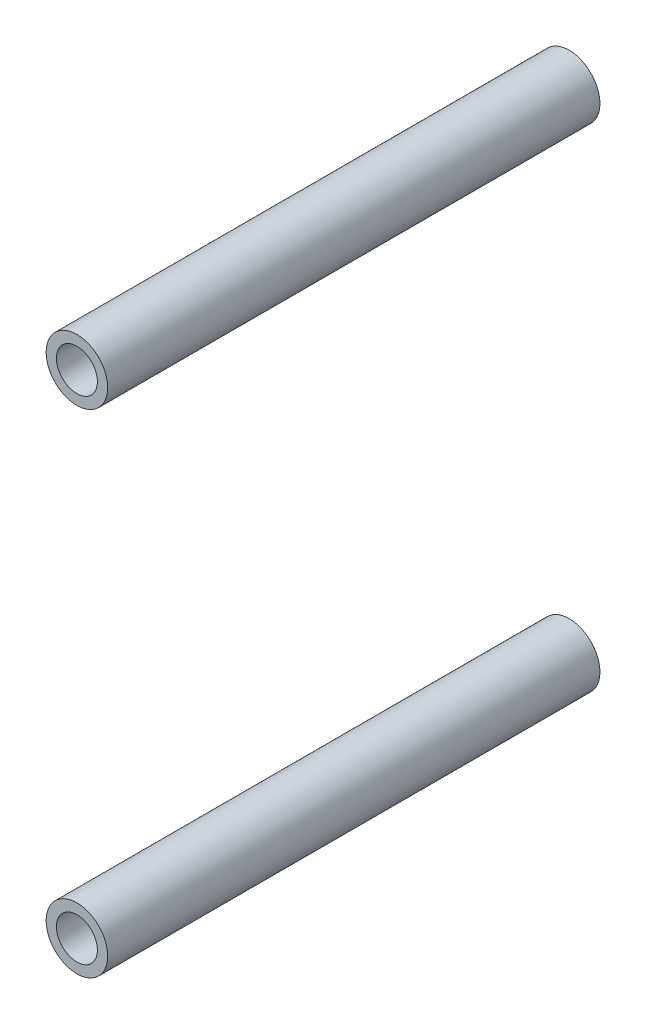
ISO-10303-21;
HEADER;
FILE_DESCRIPTION(('STEP AP214'),'2;1');
FILE_NAME('part.step','',(''),(''),'','','');
FILE_SCHEMA(('AUTOMOTIVE_DESIGN { 1 0 10303 214 1 1 1 1 }'));
ENDSEC;
DATA;
#1=APPLICATION_CONTEXT('core data for automotive mechanical design processes');
#2=APPLICATION_PROTOCOL_DEFINITION('international standard','automotive_design',2000,#1);
#3=PRODUCT_CONTEXT('',#1,'mechanical');
#4=PRODUCT('Part','Part','',(#3));
#5=PRODUCT_RELATED_PRODUCT_CATEGORY('part','',(#4));
#6=PRODUCT_DEFINITION_FORMATION('','',#4);
#7=PRODUCT_DEFINITION_CONTEXT('part definition',#1,'design');
#8=PRODUCT_DEFINITION('design','',#6,#7);
#9=PRODUCT_DEFINITION_SHAPE('','',#8);
#10=(LENGTH_UNIT() NAMED_UNIT(*) SI_UNIT(.MILLI.,.METRE.));
#11=(NAMED_UNIT(*) PLANE_ANGLE_UNIT() SI_UNIT($,.RADIAN.));
#12=(NAMED_UNIT(*) SI_UNIT($,.STERADIAN.) SOLID_ANGLE_UNIT());
#13=UNCERTAINTY_MEASURE_WITH_UNIT(LENGTH_MEASURE(1.E-05),#10,'distance_accuracy_value','');
#14=(GEOMETRIC_REPRESENTATION_CONTEXT(3) GLOBAL_UNCERTAINTY_ASSIGNED_CONTEXT((#13)) GLOBAL_UNIT_ASSIGNED_CONTEXT((#10,
#11,#12)) REPRESENTATION_CONTEXT('',''));
#15=CARTESIAN_POINT('',(0.,0.,0.));
#16=DIRECTION('',(0.,0.,1.));
#17=DIRECTION('',(1.,0.,0.));
#18=AXIS2_PLACEMENT_3D('',#15,#16,#17);
#19=CARTESIAN_POINT('',(514.35,-152.4,152.4));
#20=DIRECTION('',(0.,0.,1.));
#21=DIRECTION('',(1.,0.,0.));
#22=AXIS2_PLACEMENT_3D('',#19,#20,#21);
#23=PLANE('',#22);
#24=CARTESIAN_POINT('',(514.35,-152.4,152.4));
#25=DIRECTION('',(0.,0.,1.));
#26=DIRECTION('',(1.,0.,0.));
#27=AXIS2_PLACEMENT_3D('',#24,#25,#26);
#28=CIRCLE('',#27,19.05);
#29=CARTESIAN_POINT('',(495.3,-152.4,152.4));
#30=VERTEX_POINT('',#29);
#31=EDGE_CURVE('E11',#30,#30,#28,.T.);
#32=ORIENTED_EDGE('',*,*,#31,.T.);
#33=EDGE_LOOP('',(#32));
#34=FACE_BOUND('',#33,.T.);
#35=CARTESIAN_POINT('',(514.35,-152.4,152.4));
#36=DIRECTION('',(0.,0.,1.));
#37=DIRECTION('',(1.,0.,0.));
#38=AXIS2_PLACEMENT_3D('',#35,#36,#37);
#39=CIRCLE('',#38,12.7);
#40=CARTESIAN_POINT('',(501.65,-152.4,152.4));
#41=VERTEX_POINT('',#40);
#42=EDGE_CURVE('E50',#41,#41,#39,.T.);
#43=ORIENTED_EDGE('',*,*,#42,.F.);
#44=EDGE_LOOP('',(#43));
#45=FACE_BOUND('',#44,.T.);
#46=ADVANCED_FACE('F39',(#34,#45),#23,.T.);
#47=CARTESIAN_POINT('',(514.35,-152.4,-152.4));
#48=DIRECTION('',(0.,0.,1.));
#49=DIRECTION('',(1.,0.,0.));
#50=AXIS2_PLACEMENT_3D('',#47,#48,#49);
#51=PLANE('',#50);
#52=CARTESIAN_POINT('',(514.35,-152.4,-152.4));
#53=DIRECTION('',(0.,0.,1.));
#54=DIRECTION('',(1.,0.,0.));
#55=AXIS2_PLACEMENT_3D('',#52,#53,#54);
#56=CIRCLE('',#55,19.05);
#57=CARTESIAN_POINT('',(495.3,-152.4,-152.4));
#58=VERTEX_POINT('',#57);
#59=EDGE_CURVE('E46',#58,#58,#56,.T.);
#60=ORIENTED_EDGE('',*,*,#59,.F.);
#61=EDGE_LOOP('',(#60));
#62=FACE_BOUND('',#61,.T.);
#63=CARTESIAN_POINT('',(514.35,-152.4,-152.4));
#64=DIRECTION('',(0.,0.,1.));
#65=DIRECTION('',(1.,0.,0.));
#66=AXIS2_PLACEMENT_3D('',#63,#64,#65);
#67=CIRCLE('',#66,12.7);
#68=CARTESIAN_POINT('',(501.65,-152.4,-152.4));
#69=VERTEX_POINT('',#68);
#70=EDGE_CURVE('E54',#69,#69,#67,.T.);
#71=ORIENTED_EDGE('',*,*,#70,.T.);
#72=EDGE_LOOP('',(#71));
#73=FACE_BOUND('',#72,.T.);
#74=ADVANCED_FACE('F60',(#62,#73),#51,.F.);
#75=CARTESIAN_POINT('',(514.35,-152.4,152.4));
#76=DIRECTION('',(0.,0.,-1.));
#77=DIRECTION('',(-1.,0.,0.));
#78=AXIS2_PLACEMENT_3D('',#75,#76,#77);
#79=CYLINDRICAL_SURFACE('',#78,19.05);
#80=CARTESIAN_POINT('',(495.3,-152.4,152.4));
#81=CARTESIAN_POINT('',(495.3,-152.4,149.225));
#82=CARTESIAN_POINT('',(495.3,-152.4,146.05));
#83=CARTESIAN_POINT('',(495.3,-152.4,139.7));
#84=CARTESIAN_POINT('',(495.3,-152.4,136.525));
#85=CARTESIAN_POINT('',(495.3,-152.4,130.175));
#86=CARTESIAN_POINT('',(495.3,-152.4,127.));
#87=CARTESIAN_POINT('',(495.3,-152.4,120.65));
#88=CARTESIAN_POINT('',(495.3,-152.4,117.475));
#89=CARTESIAN_POINT('',(495.3,-152.4,111.125));
#90=CARTESIAN_POINT('',(495.3,-152.4,107.95));
#91=CARTESIAN_POINT('',(495.3,-152.4,101.6));
#92=CARTESIAN_POINT('',(495.3,-152.4,98.425));
#93=CARTESIAN_POINT('',(495.3,-152.4,92.075));
#94=CARTESIAN_POINT('',(495.3,-152.4,88.9));
#95=CARTESIAN_POINT('',(495.3,-152.4,82.55));
#96=CARTESIAN_POINT('',(495.3,-152.4,79.375));
#97=CARTESIAN_POINT('',(495.3,-152.4,73.025));
#98=CARTESIAN_POINT('',(495.3,-152.4,69.85));
#99=CARTESIAN_POINT('',(495.3,-152.4,63.5));
#100=CARTESIAN_POINT('',(495.3,-152.4,60.325));
#101=CARTESIAN_POINT('',(495.3,-152.4,53.975));
#102=CARTESIAN_POINT('',(495.3,-152.4,50.8));
#103=CARTESIAN_POINT('',(495.3,-152.4,44.45));
#104=CARTESIAN_POINT('',(495.3,-152.4,41.275));
#105=CARTESIAN_POINT('',(495.3,-152.4,34.925));
#106=CARTESIAN_POINT('',(495.3,-152.4,31.75));
#107=CARTESIAN_POINT('',(495.3,-152.4,25.4));
#108=CARTESIAN_POINT('',(495.3,-152.4,22.225));
#109=CARTESIAN_POINT('',(495.3,-152.4,15.875));
#110=CARTESIAN_POINT('',(495.3,-152.4,12.7));
#111=CARTESIAN_POINT('',(495.3,-152.4,6.35));
#112=CARTESIAN_POINT('',(495.3,-152.4,3.175));
#113=CARTESIAN_POINT('',(495.3,-152.4,-3.175));
#114=CARTESIAN_POINT('',(495.3,-152.4,-6.35));
#115=CARTESIAN_POINT('',(495.3,-152.4,-12.7));
#116=CARTESIAN_POINT('',(495.3,-152.4,-15.875));
#117=CARTESIAN_POINT('',(495.3,-152.4,-22.225));
#118=CARTESIAN_POINT('',(495.3,-152.4,-25.4));
#119=CARTESIAN_POINT('',(495.3,-152.4,-31.75));
#120=CARTESIAN_POINT('',(495.3,-152.4,-34.925));
#121=CARTESIAN_POINT('',(495.3,-152.4,-41.275));
#122=CARTESIAN_POINT('',(495.3,-152.4,-44.45));
#123=CARTESIAN_POINT('',(495.3,-152.4,-50.8));
#124=CARTESIAN_POINT('',(495.3,-152.4,-53.975));
#125=CARTESIAN_POINT('',(495.3,-152.4,-60.325));
#126=CARTESIAN_POINT('',(495.3,-152.4,-63.5));
#127=CARTESIAN_POINT('',(495.3,-152.4,-69.85));
#128=CARTESIAN_POINT('',(495.3,-152.4,-73.025));
#129=CARTESIAN_POINT('',(495.3,-152.4,-79.375));
#130=CARTESIAN_POINT('',(495.3,-152.4,-82.55));
#131=CARTESIAN_POINT('',(495.3,-152.4,-88.9));
#132=CARTESIAN_POINT('',(495.3,-152.4,-92.075));
#133=CARTESIAN_POINT('',(495.3,-152.4,-98.425));
#134=CARTESIAN_POINT('',(495.3,-152.4,-101.6));
#135=CARTESIAN_POINT('',(495.3,-152.4,-107.95));
#136=CARTESIAN_POINT('',(495.3,-152.4,-111.125));
#137=CARTESIAN_POINT('',(495.3,-152.4,-117.475));
#138=CARTESIAN_POINT('',(495.3,-152.4,-120.65));
#139=CARTESIAN_POINT('',(495.3,-152.4,-127.));
#140=CARTESIAN_POINT('',(495.3,-152.4,-130.175));
#141=CARTESIAN_POINT('',(495.3,-152.4,-136.525));
#142=CARTESIAN_POINT('',(495.3,-152.4,-139.7));
#143=CARTESIAN_POINT('',(495.3,-152.4,-146.05));
#144=CARTESIAN_POINT('',(495.3,-152.4,-149.225));
#145=CARTESIAN_POINT('',(495.3,-152.4,-152.4));
#146=B_SPLINE_CURVE_WITH_KNOTS('',3,(#80,#81,#82,#83,#84,#85,#86,#87,#88,#89,#90,#91,#92,#93,
#94,#95,#96,#97,#98,#99,#100,#101,#102,#103,#104,#105,#106,#107,#108,#109,#110,#111,#112,#113,
#114,#115,#116,#117,#118,#119,#120,#121,#122,#123,#124,#125,#126,#127,#128,#129,#130,#131,#132,
#133,#134,#135,#136,#137,#138,#139,#140,#141,#142,#143,#144,#145),.UNSPECIFIED.,.F.,.F.,(4,2,2,
2,2,2,2,2,2,2,2,2,2,2,2,2,2,2,2,2,2,2,2,2,2,2,2,2,2,2,2,2,4),(0.,9.52500000000001,19.05,28.575,
38.1,47.625,57.15,66.675,76.2,85.725,95.25,104.775,114.3,123.825,133.35,142.875,152.4,161.925,
171.45,180.975,190.5,200.025,209.55,219.075,228.6,238.125,247.65,257.175,266.7,276.225,285.75,
295.275,304.8),.UNSPECIFIED.);
#147=EDGE_CURVE('BSEAM41',#30,#58,#146,.T.);
#148=ORIENTED_EDGE('',*,*,#31,.F.);
#149=ORIENTED_EDGE('',*,*,#59,.T.);
#150=ORIENTED_EDGE('',*,*,#147,.T.);
#151=ORIENTED_EDGE('',*,*,#147,.F.);
#152=EDGE_LOOP('',(#148,#150,#149,#151));
#153=FACE_BOUND('',#152,.T.);
#154=ADVANCED_FACE('F41',(#153),#79,.T.);
#155=CARTESIAN_POINT('',(514.35,-152.4,152.4));
#156=DIRECTION('',(0.,0.,-1.));
#157=DIRECTION('',(-1.,0.,0.));
#158=AXIS2_PLACEMENT_3D('',#155,#156,#157);
#159=CYLINDRICAL_SURFACE('',#158,12.7);
#160=CARTESIAN_POINT('',(501.65,-152.4,152.4));
#161=CARTESIAN_POINT('',(501.65,-152.4,149.225));
#162=CARTESIAN_POINT('',(501.65,-152.4,146.05));
#163=CARTESIAN_POINT('',(501.65,-152.4,139.7));
#164=CARTESIAN_POINT('',(501.65,-152.4,136.525));
#165=CARTESIAN_POINT('',(501.65,-152.4,130.175));
#166=CARTESIAN_POINT('',(501.65,-152.4,127.));
#167=CARTESIAN_POINT('',(501.65,-152.4,120.65));
#168=CARTESIAN_POINT('',(501.65,-152.4,117.475));
#169=CARTESIAN_POINT('',(501.65,-152.4,111.125));
#170=CARTESIAN_POINT('',(501.65,-152.4,107.95));
#171=CARTESIAN_POINT('',(501.65,-152.4,101.6));
#172=CARTESIAN_POINT('',(501.65,-152.4,98.425));
#173=CARTESIAN_POINT('',(501.65,-152.4,92.075));
#174=CARTESIAN_POINT('',(501.65,-152.4,88.9));
#175=CARTESIAN_POINT('',(501.65,-152.4,82.55));
#176=CARTESIAN_POINT('',(501.65,-152.4,79.375));
#177=CARTESIAN_POINT('',(501.65,-152.4,73.025));
#178=CARTESIAN_POINT('',(501.65,-152.4,69.85));
#179=CARTESIAN_POINT('',(501.65,-152.4,63.5));
#180=CARTESIAN_POINT('',(501.65,-152.4,60.325));
#181=CARTESIAN_POINT('',(501.65,-152.4,53.975));
#182=CARTESIAN_POINT('',(501.65,-152.4,50.8));
#183=CARTESIAN_POINT('',(501.65,-152.4,44.45));
#184=CARTESIAN_POINT('',(501.65,-152.4,41.275));
#185=CARTESIAN_POINT('',(501.65,-152.4,34.925));
#186=CARTESIAN_POINT('',(501.65,-152.4,31.75));
#187=CARTESIAN_POINT('',(501.65,-152.4,25.4));
#188=CARTESIAN_POINT('',(501.65,-152.4,22.225));
#189=CARTESIAN_POINT('',(501.65,-152.4,15.875));
#190=CARTESIAN_POINT('',(501.65,-152.4,12.7));
#191=CARTESIAN_POINT('',(501.65,-152.4,6.35));
#192=CARTESIAN_POINT('',(501.65,-152.4,3.175));
#193=CARTESIAN_POINT('',(501.65,-152.4,-3.175));
#194=CARTESIAN_POINT('',(501.65,-152.4,-6.35));
#195=CARTESIAN_POINT('',(501.65,-152.4,-12.7));
#196=CARTESIAN_POINT('',(501.65,-152.4,-15.875));
#197=CARTESIAN_POINT('',(501.65,-152.4,-22.225));
#198=CARTESIAN_POINT('',(501.65,-152.4,-25.4));
#199=CARTESIAN_POINT('',(501.65,-152.4,-31.75));
#200=CARTESIAN_POINT('',(501.65,-152.4,-34.925));
#201=CARTESIAN_POINT('',(501.65,-152.4,-41.275));
#202=CARTESIAN_POINT('',(501.65,-152.4,-44.45));
#203=CARTESIAN_POINT('',(501.65,-152.4,-50.8));
#204=CARTESIAN_POINT('',(501.65,-152.4,-53.975));
#205=CARTESIAN_POINT('',(501.65,-152.4,-60.325));
#206=CARTESIAN_POINT('',(501.65,-152.4,-63.5));
#207=CARTESIAN_POINT('',(501.65,-152.4,-69.85));
#208=CARTESIAN_POINT('',(501.65,-152.4,-73.025));
#209=CARTESIAN_POINT('',(501.65,-152.4,-79.375));
#210=CARTESIAN_POINT('',(501.65,-152.4,-82.55));
#211=CARTESIAN_POINT('',(501.65,-152.4,-88.9));
#212=CARTESIAN_POINT('',(501.65,-152.4,-92.075));
#213=CARTESIAN_POINT('',(501.65,-152.4,-98.425));
#214=CARTESIAN_POINT('',(501.65,-152.4,-101.6));
#215=CARTESIAN_POINT('',(501.65,-152.4,-107.95));
#216=CARTESIAN_POINT('',(501.65,-152.4,-111.125));
#217=CARTESIAN_POINT('',(501.65,-152.4,-117.475));
#218=CARTESIAN_POINT('',(501.65,-152.4,-120.65));
#219=CARTESIAN_POINT('',(501.65,-152.4,-127.));
#220=CARTESIAN_POINT('',(501.65,-152.4,-130.175));
#221=CARTESIAN_POINT('',(501.65,-152.4,-136.525));
#222=CARTESIAN_POINT('',(501.65,-152.4,-139.7));
#223=CARTESIAN_POINT('',(501.65,-152.4,-146.05));
#224=CARTESIAN_POINT('',(501.65,-152.4,-149.225));
#225=CARTESIAN_POINT('',(501.65,-152.4,-152.4));
#226=B_SPLINE_CURVE_WITH_KNOTS('',3,(#160,#161,#162,#163,#164,#165,#166,#167,#168,#169,#170,
#171,#172,#173,#174,#175,#176,#177,#178,#179,#180,#181,#182,#183,#184,#185,#186,#187,#188,#189,
#190,#191,#192,#193,#194,#195,#196,#197,#198,#199,#200,#201,#202,#203,#204,#205,#206,#207,#208,
#209,#210,#211,#212,#213,#214,#215,#216,#217,#218,#219,#220,#221,#222,#223,#224,#225),
.UNSPECIFIED.,.F.,.F.,(4,2,2,2,2,2,2,2,2,2,2,2,2,2,2,2,2,2,2,2,2,2,2,2,2,2,2,2,2,2,2,2,4),(0.,
9.52500000000001,19.05,28.575,38.1,47.625,57.15,66.675,76.2,85.725,95.25,104.775,114.3,123.825,
133.35,142.875,152.4,161.925,171.45,180.975,190.5,200.025,209.55,219.075,228.6,238.125,247.65,
257.175,266.7,276.225,285.75,295.275,304.8),.UNSPECIFIED.);
#227=EDGE_CURVE('BSEAM62',#41,#69,#226,.T.);
#228=ORIENTED_EDGE('',*,*,#42,.T.);
#229=ORIENTED_EDGE('',*,*,#70,.F.);
#230=ORIENTED_EDGE('',*,*,#227,.T.);
#231=ORIENTED_EDGE('',*,*,#227,.F.);
#232=EDGE_LOOP('',(#228,#230,#229,#231));
#233=FACE_BOUND('',#232,.T.);
#234=ADVANCED_FACE('F62',(#233),#159,.F.);
#235=CLOSED_SHELL('',(#46,#74,#154,#234));
#236=MANIFOLD_SOLID_BREP('B2',#235);
#237=CARTESIAN_POINT('',(514.35,152.4,152.4));
#238=DIRECTION('',(0.,0.,1.));
#239=DIRECTION('',(1.,0.,0.));
#240=AXIS2_PLACEMENT_3D('',#237,#238,#239);
#241=PLANE('',#240);
#242=CARTESIAN_POINT('',(514.35,152.4,152.4));
#243=DIRECTION('',(0.,0.,1.));
#244=DIRECTION('',(1.,0.,0.));
#245=AXIS2_PLACEMENT_3D('',#242,#243,#244);
#246=CIRCLE('',#245,19.05);
#247=CARTESIAN_POINT('',(495.3,152.4,152.4));
#248=VERTEX_POINT('',#247);
#249=EDGE_CURVE('E38',#248,#248,#246,.T.);
#250=ORIENTED_EDGE('',*,*,#249,.T.);
#251=EDGE_LOOP('',(#250));
#252=FACE_BOUND('',#251,.T.);
#253=CARTESIAN_POINT('',(514.35,152.4,152.4));
#254=DIRECTION('',(0.,0.,1.));
#255=DIRECTION('',(1.,0.,0.));
#256=AXIS2_PLACEMENT_3D('',#253,#254,#255);
#257=CIRCLE('',#256,12.7);
#258=CARTESIAN_POINT('',(501.65,152.4,152.4));
#259=VERTEX_POINT('',#258);
#260=EDGE_CURVE('E107',#259,#259,#257,.T.);
#261=ORIENTED_EDGE('',*,*,#260,.F.);
#262=EDGE_LOOP('',(#261));
#263=FACE_BOUND('',#262,.T.);
#264=ADVANCED_FACE('F96',(#252,#263),#241,.T.);
#265=CARTESIAN_POINT('',(514.35,152.4,-152.4));
#266=DIRECTION('',(0.,0.,1.));
#267=DIRECTION('',(1.,0.,0.));
#268=AXIS2_PLACEMENT_3D('',#265,#266,#267);
#269=PLANE('',#268);
#270=CARTESIAN_POINT('',(514.35,152.4,-152.4));
#271=DIRECTION('',(0.,0.,1.));
#272=DIRECTION('',(1.,0.,0.));
#273=AXIS2_PLACEMENT_3D('',#270,#271,#272);
#274=CIRCLE('',#273,19.05);
#275=CARTESIAN_POINT('',(495.3,152.4,-152.4));
#276=VERTEX_POINT('',#275);
#277=EDGE_CURVE('E103',#276,#276,#274,.T.);
#278=ORIENTED_EDGE('',*,*,#277,.F.);
#279=EDGE_LOOP('',(#278));
#280=FACE_BOUND('',#279,.T.);
#281=CARTESIAN_POINT('',(514.35,152.4,-152.4));
#282=DIRECTION('',(0.,0.,1.));
#283=DIRECTION('',(1.,0.,0.));
#284=AXIS2_PLACEMENT_3D('',#281,#282,#283);
#285=CIRCLE('',#284,12.7);
#286=CARTESIAN_POINT('',(501.65,152.4,-152.4));
#287=VERTEX_POINT('',#286);
#288=EDGE_CURVE('E111',#287,#287,#285,.T.);
#289=ORIENTED_EDGE('',*,*,#288,.T.);
#290=EDGE_LOOP('',(#289));
#291=FACE_BOUND('',#290,.T.);
#292=ADVANCED_FACE('F117',(#280,#291),#269,.F.);
#293=CARTESIAN_POINT('',(514.35,152.4,152.4));
#294=DIRECTION('',(0.,0.,-1.));
#295=DIRECTION('',(-1.,0.,0.));
#296=AXIS2_PLACEMENT_3D('',#293,#294,#295);
#297=CYLINDRICAL_SURFACE('',#296,19.05);
#298=CARTESIAN_POINT('',(495.3,152.4,152.4));
#299=CARTESIAN_POINT('',(495.3,152.4,149.225));
#300=CARTESIAN_POINT('',(495.3,152.4,146.05));
#301=CARTESIAN_POINT('',(495.3,152.4,139.7));
#302=CARTESIAN_POINT('',(495.3,152.4,136.525));
#303=CARTESIAN_POINT('',(495.3,152.4,130.175));
#304=CARTESIAN_POINT('',(495.3,152.4,127.));
#305=CARTESIAN_POINT('',(495.3,152.4,120.65));
#306=CARTESIAN_POINT('',(495.3,152.4,117.475));
#307=CARTESIAN_POINT('',(495.3,152.4,111.125));
#308=CARTESIAN_POINT('',(495.3,152.4,107.95));
#309=CARTESIAN_POINT('',(495.3,152.4,101.6));
#310=CARTESIAN_POINT('',(495.3,152.4,98.425));
#311=CARTESIAN_POINT('',(495.3,152.4,92.075));
#312=CARTESIAN_POINT('',(495.3,152.4,88.9));
#313=CARTESIAN_POINT('',(495.3,152.4,82.55));
#314=CARTESIAN_POINT('',(495.3,152.4,79.375));
#315=CARTESIAN_POINT('',(495.3,152.4,73.025));
#316=CARTESIAN_POINT('',(495.3,152.4,69.85));
#317=CARTESIAN_POINT('',(495.3,152.4,63.5));
#318=CARTESIAN_POINT('',(495.3,152.4,60.325));
#319=CARTESIAN_POINT('',(495.3,152.4,53.975));
#320=CARTESIAN_POINT('',(495.3,152.4,50.8));
#321=CARTESIAN_POINT('',(495.3,152.4,44.45));
#322=CARTESIAN_POINT('',(495.3,152.4,41.275));
#323=CARTESIAN_POINT('',(495.3,152.4,34.925));
#324=CARTESIAN_POINT('',(495.3,152.4,31.75));
#325=CARTESIAN_POINT('',(495.3,152.4,25.4));
#326=CARTESIAN_POINT('',(495.3,152.4,22.225));
#327=CARTESIAN_POINT('',(495.3,152.4,15.875));
#328=CARTESIAN_POINT('',(495.3,152.4,12.7));
#329=CARTESIAN_POINT('',(495.3,152.4,6.35));
#330=CARTESIAN_POINT('',(495.3,152.4,3.175));
#331=CARTESIAN_POINT('',(495.3,152.4,-3.175));
#332=CARTESIAN_POINT('',(495.3,152.4,-6.35));
#333=CARTESIAN_POINT('',(495.3,152.4,-12.7));
#334=CARTESIAN_POINT('',(495.3,152.4,-15.875));
#335=CARTESIAN_POINT('',(495.3,152.4,-22.225));
#336=CARTESIAN_POINT('',(495.3,152.4,-25.4));
#337=CARTESIAN_POINT('',(495.3,152.4,-31.75));
#338=CARTESIAN_POINT('',(495.3,152.4,-34.925));
#339=CARTESIAN_POINT('',(495.3,152.4,-41.275));
#340=CARTESIAN_POINT('',(495.3,152.4,-44.45));
#341=CARTESIAN_POINT('',(495.3,152.4,-50.8));
#342=CARTESIAN_POINT('',(495.3,152.4,-53.975));
#343=CARTESIAN_POINT('',(495.3,152.4,-60.325));
#344=CARTESIAN_POINT('',(495.3,152.4,-63.5));
#345=CARTESIAN_POINT('',(495.3,152.4,-69.85));
#346=CARTESIAN_POINT('',(495.3,152.4,-73.025));
#347=CARTESIAN_POINT('',(495.3,152.4,-79.375));
#348=CARTESIAN_POINT('',(495.3,152.4,-82.55));
#349=CARTESIAN_POINT('',(495.3,152.4,-88.9));
#350=CARTESIAN_POINT('',(495.3,152.4,-92.075));
#351=CARTESIAN_POINT('',(495.3,152.4,-98.425));
#352=CARTESIAN_POINT('',(495.3,152.4,-101.6));
#353=CARTESIAN_POINT('',(495.3,152.4,-107.95));
#354=CARTESIAN_POINT('',(495.3,152.4,-111.125));
#355=CARTESIAN_POINT('',(495.3,152.4,-117.475));
#356=CARTESIAN_POINT('',(495.3,152.4,-120.65));
#357=CARTESIAN_POINT('',(495.3,152.4,-127.));
#358=CARTESIAN_POINT('',(495.3,152.4,-130.175));
#359=CARTESIAN_POINT('',(495.3,152.4,-136.525));
#360=CARTESIAN_POINT('',(495.3,152.4,-139.7));
#361=CARTESIAN_POINT('',(495.3,152.4,-146.05));
#362=CARTESIAN_POINT('',(495.3,152.4,-149.225));
#363=CARTESIAN_POINT('',(495.3,152.4,-152.4));
#364=B_SPLINE_CURVE_WITH_KNOTS('',3,(#298,#299,#300,#301,#302,#303,#304,#305,#306,#307,#308,
#309,#310,#311,#312,#313,#314,#315,#316,#317,#318,#319,#320,#321,#322,#323,#324,#325,#326,#327,
#328,#329,#330,#331,#332,#333,#334,#335,#336,#337,#338,#339,#340,#341,#342,#343,#344,#345,#346,
#347,#348,#349,#350,#351,#352,#353,#354,#355,#356,#357,#358,#359,#360,#361,#362,#363),
.UNSPECIFIED.,.F.,.F.,(4,2,2,2,2,2,2,2,2,2,2,2,2,2,2,2,2,2,2,2,2,2,2,2,2,2,2,2,2,2,2,2,4),(0.,
9.52500000000001,19.05,28.575,38.1,47.625,57.15,66.675,76.2,85.725,95.25,104.775,114.3,123.825,
133.35,142.875,152.4,161.925,171.45,180.975,190.5,200.025,209.55,219.075,228.6,238.125,247.65,
257.175,266.7,276.225,285.75,295.275,304.8),.UNSPECIFIED.);
#365=EDGE_CURVE('BSEAM98',#248,#276,#364,.T.);
#366=ORIENTED_EDGE('',*,*,#249,.F.);
#367=ORIENTED_EDGE('',*,*,#277,.T.);
#368=ORIENTED_EDGE('',*,*,#365,.T.);
#369=ORIENTED_EDGE('',*,*,#365,.F.);
#370=EDGE_LOOP('',(#366,#368,#367,#369));
#371=FACE_BOUND('',#370,.T.);
#372=ADVANCED_FACE('F98',(#371),#297,.T.);
#373=CARTESIAN_POINT('',(514.35,152.4,152.4));
#374=DIRECTION('',(0.,0.,-1.));
#375=DIRECTION('',(-1.,0.,0.));
#376=AXIS2_PLACEMENT_3D('',#373,#374,#375);
#377=CYLINDRICAL_SURFACE('',#376,12.7);
#378=CARTESIAN_POINT('',(501.65,152.4,152.4));
#379=CARTESIAN_POINT('',(501.65,152.4,149.225));
#380=CARTESIAN_POINT('',(501.65,152.4,146.05));
#381=CARTESIAN_POINT('',(501.65,152.4,139.7));
#382=CARTESIAN_POINT('',(501.65,152.4,136.525));
#383=CARTESIAN_POINT('',(501.65,152.4,130.175));
#384=CARTESIAN_POINT('',(501.65,152.4,127.));
#385=CARTESIAN_POINT('',(501.65,152.4,120.65));
#386=CARTESIAN_POINT('',(501.65,152.4,117.475));
#387=CARTESIAN_POINT('',(501.65,152.4,111.125));
#388=CARTESIAN_POINT('',(501.65,152.4,107.95));
#389=CARTESIAN_POINT('',(501.65,152.4,101.6));
#390=CARTESIAN_POINT('',(501.65,152.4,98.425));
#391=CARTESIAN_POINT('',(501.65,152.4,92.075));
#392=CARTESIAN_POINT('',(501.65,152.4,88.9));
#393=CARTESIAN_POINT('',(501.65,152.4,82.55));
#394=CARTESIAN_POINT('',(501.65,152.4,79.375));
#395=CARTESIAN_POINT('',(501.65,152.4,73.025));
#396=CARTESIAN_POINT('',(501.65,152.4,69.85));
#397=CARTESIAN_POINT('',(501.65,152.4,63.5));
#398=CARTESIAN_POINT('',(501.65,152.4,60.325));
#399=CARTESIAN_POINT('',(501.65,152.4,53.975));
#400=CARTESIAN_POINT('',(501.65,152.4,50.8));
#401=CARTESIAN_POINT('',(501.65,152.4,44.45));
#402=CARTESIAN_POINT('',(501.65,152.4,41.275));
#403=CARTESIAN_POINT('',(501.65,152.4,34.925));
#404=CARTESIAN_POINT('',(501.65,152.4,31.75));
#405=CARTESIAN_POINT('',(501.65,152.4,25.4));
#406=CARTESIAN_POINT('',(501.65,152.4,22.225));
#407=CARTESIAN_POINT('',(501.65,152.4,15.875));
#408=CARTESIAN_POINT('',(501.65,152.4,12.7));
#409=CARTESIAN_POINT('',(501.65,152.4,6.35));
#410=CARTESIAN_POINT('',(501.65,152.4,3.175));
#411=CARTESIAN_POINT('',(501.65,152.4,-3.175));
#412=CARTESIAN_POINT('',(501.65,152.4,-6.35));
#413=CARTESIAN_POINT('',(501.65,152.4,-12.7));
#414=CARTESIAN_POINT('',(501.65,152.4,-15.875));
#415=CARTESIAN_POINT('',(501.65,152.4,-22.225));
#416=CARTESIAN_POINT('',(501.65,152.4,-25.4));
#417=CARTESIAN_POINT('',(501.65,152.4,-31.75));
#418=CARTESIAN_POINT('',(501.65,152.4,-34.925));
#419=CARTESIAN_POINT('',(501.65,152.4,-41.275));
#420=CARTESIAN_POINT('',(501.65,152.4,-44.45));
#421=CARTESIAN_POINT('',(501.65,152.4,-50.8));
#422=CARTESIAN_POINT('',(501.65,152.4,-53.975));
#423=CARTESIAN_POINT('',(501.65,152.4,-60.325));
#424=CARTESIAN_POINT('',(501.65,152.4,-63.5));
#425=CARTESIAN_POINT('',(501.65,152.4,-69.85));
#426=CARTESIAN_POINT('',(501.65,152.4,-73.025));
#427=CARTESIAN_POINT('',(501.65,152.4,-79.375));
#428=CARTESIAN_POINT('',(501.65,152.4,-82.55));
#429=CARTESIAN_POINT('',(501.65,152.4,-88.9));
#430=CARTESIAN_POINT('',(501.65,152.4,-92.075));
#431=CARTESIAN_POINT('',(501.65,152.4,-98.425));
#432=CARTESIAN_POINT('',(501.65,152.4,-101.6));
#433=CARTESIAN_POINT('',(501.65,152.4,-107.95));
#434=CARTESIAN_POINT('',(501.65,152.4,-111.125));
#435=CARTESIAN_POINT('',(501.65,152.4,-117.475));
#436=CARTESIAN_POINT('',(501.65,152.4,-120.65));
#437=CARTESIAN_POINT('',(501.65,152.4,-127.));
#438=CARTESIAN_POINT('',(501.65,152.4,-130.175));
#439=CARTESIAN_POINT('',(501.65,152.4,-136.525));
#440=CARTESIAN_POINT('',(501.65,152.4,-139.7));
#441=CARTESIAN_POINT('',(501.65,152.4,-146.05));
#442=CARTESIAN_POINT('',(501.65,152.4,-149.225));
#443=CARTESIAN_POINT('',(501.65,152.4,-152.4));
#444=B_SPLINE_CURVE_WITH_KNOTS('',3,(#378,#379,#380,#381,#382,#383,#384,#385,#386,#387,#388,
#389,#390,#391,#392,#393,#394,#395,#396,#397,#398,#399,#400,#401,#402,#403,#404,#405,#406,#407,
#408,#409,#410,#411,#412,#413,#414,#415,#416,#417,#418,#419,#420,#421,#422,#423,#424,#425,#426,
#427,#428,#429,#430,#431,#432,#433,#434,#435,#436,#437,#438,#439,#440,#441,#442,#443),
.UNSPECIFIED.,.F.,.F.,(4,2,2,2,2,2,2,2,2,2,2,2,2,2,2,2,2,2,2,2,2,2,2,2,2,2,2,2,2,2,2,2,4),(0.,
9.52500000000001,19.05,28.575,38.1,47.625,57.15,66.675,76.2,85.725,95.25,104.775,114.3,123.825,
133.35,142.875,152.4,161.925,171.45,180.975,190.5,200.025,209.55,219.075,228.6,238.125,247.65,
257.175,266.7,276.225,285.75,295.275,304.8),.UNSPECIFIED.);
#445=EDGE_CURVE('BSEAM119',#259,#287,#444,.T.);
#446=ORIENTED_EDGE('',*,*,#260,.T.);
#447=ORIENTED_EDGE('',*,*,#288,.F.);
#448=ORIENTED_EDGE('',*,*,#445,.T.);
#449=ORIENTED_EDGE('',*,*,#445,.F.);
#450=EDGE_LOOP('',(#446,#448,#447,#449));
#451=FACE_BOUND('',#450,.T.);
#452=ADVANCED_FACE('F119',(#451),#377,.F.);
#453=CLOSED_SHELL('',(#264,#292,#372,#452));
#454=MANIFOLD_SOLID_BREP('B6',#453);
#455=ADVANCED_BREP_SHAPE_REPRESENTATION('',(#18,#236,#454),#14);
#456=SHAPE_DEFINITION_REPRESENTATION(#9,#455);
ENDSEC;
END-ISO-10303-21;
